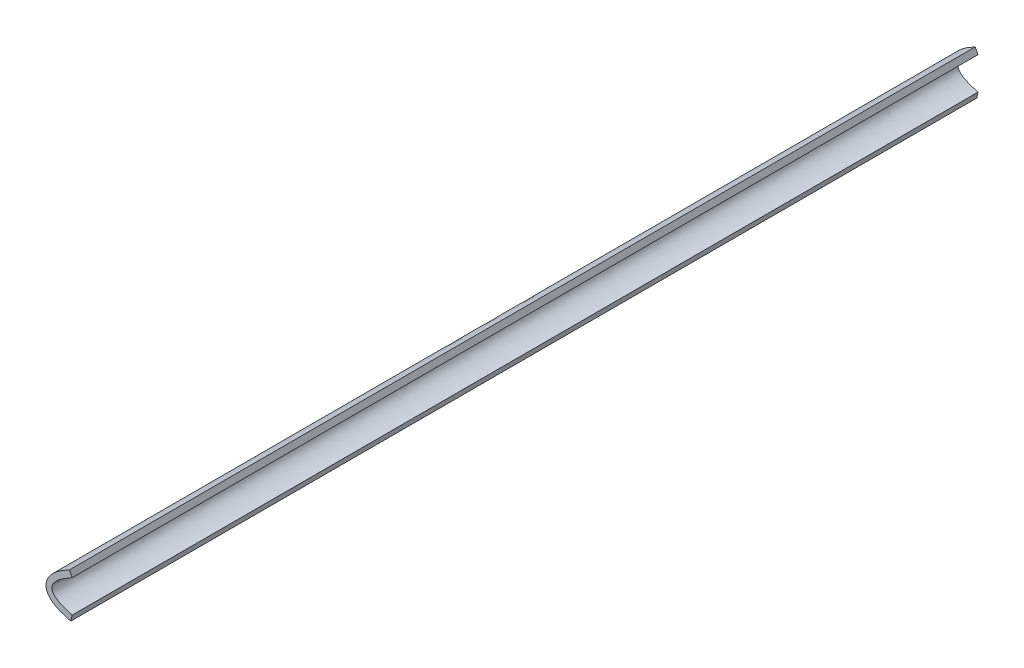
ISO-10303-21;
HEADER;
FILE_DESCRIPTION(('STEP AP214'),'2;1');
FILE_NAME('part.step','',(''),(''),'','','');
FILE_SCHEMA(('AUTOMOTIVE_DESIGN { 1 0 10303 214 1 1 1 1 }'));
ENDSEC;
DATA;
#1=APPLICATION_CONTEXT('core data for automotive mechanical design processes');
#2=APPLICATION_PROTOCOL_DEFINITION('international standard','automotive_design',2000,#1);
#3=PRODUCT_CONTEXT('',#1,'mechanical');
#4=PRODUCT('Part','Part','',(#3));
#5=PRODUCT_RELATED_PRODUCT_CATEGORY('part','',(#4));
#6=PRODUCT_DEFINITION_FORMATION('','',#4);
#7=PRODUCT_DEFINITION_CONTEXT('part definition',#1,'design');
#8=PRODUCT_DEFINITION('design','',#6,#7);
#9=PRODUCT_DEFINITION_SHAPE('','',#8);
#10=(LENGTH_UNIT() NAMED_UNIT(*) SI_UNIT(.MILLI.,.METRE.));
#11=(NAMED_UNIT(*) PLANE_ANGLE_UNIT() SI_UNIT($,.RADIAN.));
#12=(NAMED_UNIT(*) SI_UNIT($,.STERADIAN.) SOLID_ANGLE_UNIT());
#13=UNCERTAINTY_MEASURE_WITH_UNIT(LENGTH_MEASURE(1.E-05),#10,'distance_accuracy_value','');
#14=(GEOMETRIC_REPRESENTATION_CONTEXT(3) GLOBAL_UNCERTAINTY_ASSIGNED_CONTEXT((#13)) GLOBAL_UNIT_ASSIGNED_CONTEXT((#10,
#11,#12)) REPRESENTATION_CONTEXT('',''));
#15=CARTESIAN_POINT('',(0.,0.,0.));
#16=DIRECTION('',(0.,0.,1.));
#17=DIRECTION('',(1.,0.,0.));
#18=AXIS2_PLACEMENT_3D('',#15,#16,#17);
#19=CARTESIAN_POINT('',(21.4958554702346,18.1549970533936,750.));
#20=CARTESIAN_POINT('',(-12.0820568694319,0.0796441889705399,750.));
#21=CARTESIAN_POINT('',(21.4959399437409,-8.70720274628387,750.));
#22=B_SPLINE_CURVE_WITH_KNOTS('',2,(#19,#20,#21),.UNSPECIFIED.,.F.,.F.,(3,3),(0.,1.),.UNSPECIFIED.);
#23=DIRECTION('',(0.,0.,-1.));
#24=VECTOR('',#23,1.);
#25=SURFACE_OF_LINEAR_EXTRUSION('',#22,#24);
#26=CARTESIAN_POINT('',(21.4958554702346,18.1549970533936,0.));
#27=CARTESIAN_POINT('',(-12.0820568694319,0.0796441889705399,0.));
#28=CARTESIAN_POINT('',(21.4959399437409,-8.70720274628387,0.));
#29=B_SPLINE_CURVE_WITH_KNOTS('',2,(#26,#27,#28),.UNSPECIFIED.,.F.,.F.,(3,3),(0.,1.),.UNSPECIFIED.);
#30=CARTESIAN_POINT('',(21.4958554702346,18.1549970533936,0.));
#31=VERTEX_POINT('',#30);
#32=CARTESIAN_POINT('',(21.4959399437409,-8.70720274628387,0.));
#33=VERTEX_POINT('',#32);
#34=EDGE_CURVE('E141',#31,#33,#29,.T.);
#35=ORIENTED_EDGE('',*,*,#34,.F.);
#36=DIRECTION('',(0.,0.,-1.));
#37=VECTOR('',#36,1.);
#38=CARTESIAN_POINT('',(21.4958554702346,18.1549970533936,750.));
#39=LINE('',#38,#37);
#40=CARTESIAN_POINT('',(21.4958554702346,18.1549970533936,750.));
#41=VERTEX_POINT('',#40);
#42=EDGE_CURVE('E11',#41,#31,#39,.T.);
#43=ORIENTED_EDGE('',*,*,#42,.F.);
#44=CARTESIAN_POINT('',(21.4959399437409,-8.70720274628387,750.));
#45=VERTEX_POINT('',#44);
#46=EDGE_CURVE('E162',#41,#45,#22,.T.);
#47=ORIENTED_EDGE('',*,*,#46,.T.);
#48=DIRECTION('',(0.,0.,-1.));
#49=VECTOR('',#48,1.);
#50=CARTESIAN_POINT('',(21.4959399437409,-8.70720274628387,750.));
#51=LINE('',#50,#49);
#52=EDGE_CURVE('E58',#45,#33,#51,.T.);
#53=ORIENTED_EDGE('',*,*,#52,.T.);
#54=EDGE_LOOP('',(#35,#43,#47,#53));
#55=FACE_BOUND('',#54,.T.);
#56=ADVANCED_FACE('F41',(#55),#25,.T.);
#57=CARTESIAN_POINT('',(24.398905648412,12.4789294185756,750.));
#58=DIRECTION('',(0.890310765963519,0.455353423188464,0.));
#59=DIRECTION('',(-0.455353423188464,0.890310765963519,0.));
#60=AXIS2_PLACEMENT_3D('',#57,#58,#59);
#61=PLANE('',#60);
#62=DIRECTION('',(0.455353423188464,-0.890310765963519,0.));
#63=VECTOR('',#62,1.);
#64=CARTESIAN_POINT('',(24.398905648412,12.4789294185756,0.));
#65=LINE('',#64,#63);
#66=CARTESIAN_POINT('',(19.2190883542923,22.6065508832112,0.));
#67=VERTEX_POINT('',#66);
#68=EDGE_CURVE('E139',#67,#31,#65,.T.);
#69=ORIENTED_EDGE('',*,*,#68,.F.);
#70=DIRECTION('',(0.,0.,-1.));
#71=VECTOR('',#70,1.);
#72=CARTESIAN_POINT('',(19.2190883542923,22.6065508832112,750.));
#73=LINE('',#72,#71);
#74=CARTESIAN_POINT('',(19.2190883542923,22.6065508832112,750.));
#75=VERTEX_POINT('',#74);
#76=EDGE_CURVE('E50',#75,#67,#73,.T.);
#77=ORIENTED_EDGE('',*,*,#76,.F.);
#78=DIRECTION('',(0.455353423188464,-0.890310765963519,0.));
#79=VECTOR('',#78,1.);
#80=CARTESIAN_POINT('',(24.398905648412,12.4789294185756,750.));
#81=LINE('',#80,#79);
#82=EDGE_CURVE('E98',#75,#41,#81,.T.);
#83=ORIENTED_EDGE('',*,*,#82,.T.);
#84=ORIENTED_EDGE('',*,*,#42,.T.);
#85=EDGE_LOOP('',(#69,#77,#83,#84));
#86=FACE_BOUND('',#85,.T.);
#87=ADVANCED_FACE('F131',(#86),#61,.T.);
#88=CARTESIAN_POINT('',(300.070000000009,0.559999999999606,750.));
#89=CARTESIAN_POINT('',(300.046727210838,0.57014946527181,750.));
#90=CARTESIAN_POINT('',(299.951918410927,0.611496405472444,750.));
#91=CARTESIAN_POINT('',(299.731451090185,0.687910176410011,750.));
#92=CARTESIAN_POINT('',(299.360701306177,0.802077760347153,750.));
#93=CARTESIAN_POINT('',(298.851143071171,0.990049760142529,750.));
#94=CARTESIAN_POINT('',(298.192762058047,1.21498955742899,750.));
#95=CARTESIAN_POINT('',(297.39058131591,1.49834771116358,750.));
#96=CARTESIAN_POINT('',(296.440162643631,1.82713144456083,750.));
#97=CARTESIAN_POINT('',(295.347552696138,2.20591589840112,750.));
#98=CARTESIAN_POINT('',(294.109915847856,2.62641666355169,750.));
#99=CARTESIAN_POINT('',(292.734867314937,3.09787554254288,750.));
#100=CARTESIAN_POINT('',(291.212205013657,3.60330160879851,750.));
#101=CARTESIAN_POINT('',(289.556778296054,4.17036010371409,750.));
#102=CARTESIAN_POINT('',(287.754541523661,4.75022942363347,750.));
#103=CARTESIAN_POINT('',(285.826587722534,5.39992229408479,750.));
#104=CARTESIAN_POINT('',(283.756363975349,6.06242105527255,750.));
#105=CARTESIAN_POINT('',(281.558560220993,6.77588707650856,750.));
#106=CARTESIAN_POINT('',(279.225625429957,7.5173074076064,750.));
#107=CARTESIAN_POINT('',(276.759052145959,8.2802981760638,750.));
#108=CARTESIAN_POINT('',(274.172767845115,9.09557710973343,750.));
#109=CARTESIAN_POINT('',(271.45955356681,9.92624020632865,750.));
#110=CARTESIAN_POINT('',(268.620233524828,10.7707661803998,750.));
#111=CARTESIAN_POINT('',(265.66703106841,11.6559297276713,750.));
#112=CARTESIAN_POINT('',(262.589976023508,12.5399347522996,750.));
#113=CARTESIAN_POINT('',(259.406507792868,13.4644296130216,750.));
#114=CARTESIAN_POINT('',(256.106091200659,14.3932678621578,750.));
#115=CARTESIAN_POINT('',(252.694259978673,15.3300326956432,750.));
#116=CARTESIAN_POINT('',(249.183398903871,16.2926089703338,750.));
#117=CARTESIAN_POINT('',(245.565461502502,17.2514346555858,750.));
#118=CARTESIAN_POINT('',(241.852861879338,18.2210826299672,750.));
#119=CARTESIAN_POINT('',(238.042855475645,19.1913810301566,750.));
#120=CARTESIAN_POINT('',(234.140998951705,20.157357319934,750.));
#121=CARTESIAN_POINT('',(230.154027102527,21.1433044568455,750.));
#122=CARTESIAN_POINT('',(226.07941307726,22.108408476858,750.));
#123=CARTESIAN_POINT('',(221.926457871224,23.0703556384359,750.));
#124=CARTESIAN_POINT('',(217.6962775731,24.0199849043638,750.));
#125=CARTESIAN_POINT('',(213.392335784255,24.9575190841546,750.));
#126=CARTESIAN_POINT('',(209.022179153199,25.8870238282288,750.));
#127=CARTESIAN_POINT('',(204.590060503874,26.8099246596024,750.));
#128=CARTESIAN_POINT('',(200.100470304697,27.7094915488814,750.));
#129=CARTESIAN_POINT('',(195.551555783891,28.5748749529662,750.));
#130=CARTESIAN_POINT('',(190.95710115256,29.4405805115664,750.));
#131=CARTESIAN_POINT('',(186.312819207174,30.2661537119284,750.));
#132=CARTESIAN_POINT('',(181.629850434367,31.0690924620077,750.));
#133=CARTESIAN_POINT('',(176.9116334721,31.8335044141093,750.));
#134=CARTESIAN_POINT('',(172.163553807855,32.5897563409087,750.));
#135=CARTESIAN_POINT('',(167.38637831359,33.2979132291314,750.));
#136=CARTESIAN_POINT('',(162.585397476233,33.965141895421,750.));
#137=CARTESIAN_POINT('',(157.772606772563,34.6069052400814,750.));
#138=CARTESIAN_POINT('',(152.945783838143,35.2070309507983,750.));
#139=CARTESIAN_POINT('',(148.116103717064,35.7683712182421,750.));
#140=CARTESIAN_POINT('',(143.281947921397,36.2759641136444,750.));
#141=CARTESIAN_POINT('',(138.451826021007,36.7461668630659,750.));
#142=CARTESIAN_POINT('',(133.632024585046,37.1774202436999,750.));
#143=CARTESIAN_POINT('',(128.825099135922,37.5570095720901,750.));
#144=CARTESIAN_POINT('',(124.0352682766,37.8909649193306,750.));
#145=CARTESIAN_POINT('',(119.227934324095,38.1580563961838,750.));
#146=CARTESIAN_POINT('',(114.414879536341,38.3839309655849,750.));
#147=CARTESIAN_POINT('',(109.600810746422,38.5231711888418,750.));
#148=CARTESIAN_POINT('',(104.830170116063,38.5812091028124,750.));
#149=CARTESIAN_POINT('',(100.103024464491,38.5711871037619,750.));
#150=CARTESIAN_POINT('',(95.4289177756723,38.4952426315103,750.));
#151=CARTESIAN_POINT('',(90.8118079707387,38.3323263522947,750.));
#152=CARTESIAN_POINT('',(86.2578215279774,38.1037402151062,750.));
#153=CARTESIAN_POINT('',(81.7706420322065,37.8028926780969,750.));
#154=CARTESIAN_POINT('',(77.3556639029616,37.4394017022477,750.));
#155=CARTESIAN_POINT('',(73.0231073717325,36.9817558492871,750.));
#156=CARTESIAN_POINT('',(68.7745873700511,36.4785227821482,750.));
#157=CARTESIAN_POINT('',(64.6181040246302,35.8952175381654,750.));
#158=CARTESIAN_POINT('',(60.552867782823,35.2591686102274,750.));
#159=CARTESIAN_POINT('',(56.5894272314716,34.548268384025,750.));
#160=CARTESIAN_POINT('',(52.728147609376,33.7805282280188,750.));
#161=CARTESIAN_POINT('',(48.9784809853801,32.9486222007632,750.));
#162=CARTESIAN_POINT('',(45.3406482062456,32.0705009481565,750.));
#163=CARTESIAN_POINT('',(41.8175978305396,31.1446852043062,750.));
#164=CARTESIAN_POINT('',(38.4225138687805,30.1522778689638,750.));
#165=CARTESIAN_POINT('',(35.1484262755672,29.1221398243421,750.));
#166=CARTESIAN_POINT('',(32.0024888843364,28.0567605707498,750.));
#167=CARTESIAN_POINT('',(28.9910532160996,26.947357350049,750.));
#168=CARTESIAN_POINT('',(26.1161432589965,25.7977619494281,750.));
#169=CARTESIAN_POINT('',(23.3820300010664,24.605992476619,750.));
#170=CARTESIAN_POINT('',(20.7789312399974,23.403436919697,750.));
#171=CARTESIAN_POINT('',(18.3282822679355,22.1583471316499,750.));
#172=CARTESIAN_POINT('',(16.0188302677939,20.9064502673966,750.));
#173=CARTESIAN_POINT('',(13.8628973732302,19.6215652077166,750.));
#174=CARTESIAN_POINT('',(11.8547380257014,18.3242676681531,750.));
#175=CARTESIAN_POINT('',(9.99188655882919,17.0192098294199,750.));
#176=CARTESIAN_POINT('',(8.29105075030026,15.6956485942382,750.));
#177=CARTESIAN_POINT('',(6.73373760295228,14.3771786431372,750.));
#178=CARTESIAN_POINT('',(5.33311142752208,13.0499076520752,750.));
#179=CARTESIAN_POINT('',(4.08838789599282,11.7194177408118,750.));
#180=CARTESIAN_POINT('',(3.00075757832663,10.3893770732718,750.));
#181=CARTESIAN_POINT('',(2.0837737167411,9.05642543101119,750.));
#182=CARTESIAN_POINT('',(1.29666389493232,7.74190201537552,750.));
#183=CARTESIAN_POINT('',(0.688475961139798,6.42274039721468,750.));
#184=CARTESIAN_POINT('',(0.232629270456275,5.11301943414384,750.));
#185=CARTESIAN_POINT('',(-0.0741168979006899,3.81676478454145,750.));
#186=CARTESIAN_POINT('',(-0.216963808852273,2.52703073355145,750.));
#187=CARTESIAN_POINT('',(-0.194835648763117,1.25098158157196,750.));
#188=CARTESIAN_POINT('',(-0.0816996889988518,0.412720493044762,750.));
#189=CARTESIAN_POINT('',(6.86038103125013E-10,-3.46758561693545E-09,750.));
#190=B_SPLINE_CURVE_WITH_KNOTS('',3,(#88,#89,#90,#91,#92,#93,#94,#95,#96,#97,#98,#99,#100,#101,
#102,#103,#104,#105,#106,#107,#108,#109,#110,#111,#112,#113,#114,#115,#116,#117,#118,#119,#120,
#121,#122,#123,#124,#125,#126,#127,#128,#129,#130,#131,#132,#133,#134,#135,#136,#137,#138,#139,
#140,#141,#142,#143,#144,#145,#146,#147,#148,#149,#150,#151,#152,#153,#154,#155,#156,#157,#158,
#159,#160,#161,#162,#163,#164,#165,#166,#167,#168,#169,#170,#171,#172,#173,#174,#175,#176,#177,
#178,#179,#180,#181,#182,#183,#184,#185,#186,#187,#188,#189),.UNSPECIFIED.,.F.,.F.,(4,1,1,1,1,1,
1,1,1,1,1,1,1,1,1,1,1,1,1,1,1,1,1,1,1,1,1,1,1,1,1,1,1,1,1,1,1,1,1,1,1,1,1,1,1,1,1,1,1,1,1,1,1,1,
1,1,1,1,1,1,1,1,1,1,1,1,1,1,1,1,1,1,1,1,1,1,1,1,1,1,1,1,1,1,1,1,1,1,1,1,1,1,1,1,1,1,1,1,1,4),
(0.,0.000121802045916605,0.000496197757592308,0.00111829754146197,0.00198327247421803,
0.00310109503456608,0.00445667065088207,0.00606510026662876,0.00792639033067934,
0.0100051006761166,0.0123366827495954,0.0149008679576207,0.0177027715059171,0.0207322847510818,
0.0239842963399837,0.027464026273719,0.031161268245018,0.0350711538259491,0.0392090248767433,
0.0435491612294342,0.0480820960038832,0.0528232938835928,0.0577621196773443,0.0628742543135626,
0.0681840845984971,0.0736674862169605,0.0793246499392333,0.0851599372063481,0.0911342131365787,
0.0972826896563106,0.103570554381949,0.10999800798771,0.116569034804591,0.123276218058606,
0.13008874608338,0.137022467248384,0.144077656318622,0.151223284866333,0.158459530455229,
0.165799086141327,0.173192203581115,0.180676632663918,0.188231102607015,0.195824579266017,
0.203473250814262,0.211164226832504,0.218892941548552,0.22664419478934,0.234420668227768,
0.242188980013251,0.249981422868409,0.257749174871681,0.265510469999164,0.273265830607315,
0.280966677998178,0.288645671703493,0.296302699243563,0.304067470550499,0.31176355002067,
0.319408993713125,0.326957891756819,0.334443892775123,0.341837269696896,0.349123554457684,
0.356320598702043,0.363414402847302,0.370376839159325,0.377222795683193,0.383940401176468,
0.390513899376016,0.396964016788803,0.403259098024054,0.40940176833071,0.415391074824066,
0.421213921667111,0.426877502278438,0.432360647328028,0.437681281381694,0.442812194902764,
0.447757076574934,0.452534712671014,0.457121248364812,0.461512912707052,0.465721241925177,
0.469723075006934,0.473551513613339,0.477190036693361,0.48063229623885,0.483888395344838,
0.486976776934193,0.489884980817169,0.492625083473646,0.495211517132313,0.497641776091882,
0.499967426494959,0.502167608105882,0.504285811993246,0.506345174727357,0.508376587381055,
0.510394165054345),.UNSPECIFIED.);
#191=DIRECTION('',(0.,0.,-1.));
#192=VECTOR('',#191,1.);
#193=SURFACE_OF_LINEAR_EXTRUSION('',#190,#192);
#194=CARTESIAN_POINT('',(300.070000000009,0.559999999999606,0.));
#195=CARTESIAN_POINT('',(300.046727210838,0.57014946527181,0.));
#196=CARTESIAN_POINT('',(299.951918410927,0.611496405472444,0.));
#197=CARTESIAN_POINT('',(299.731451090185,0.687910176410011,0.));
#198=CARTESIAN_POINT('',(299.360701306177,0.802077760347153,0.));
#199=CARTESIAN_POINT('',(298.851143071171,0.990049760142529,0.));
#200=CARTESIAN_POINT('',(298.192762058047,1.21498955742899,0.));
#201=CARTESIAN_POINT('',(297.39058131591,1.49834771116358,0.));
#202=CARTESIAN_POINT('',(296.440162643631,1.82713144456083,0.));
#203=CARTESIAN_POINT('',(295.347552696138,2.20591589840112,0.));
#204=CARTESIAN_POINT('',(294.109915847856,2.62641666355169,0.));
#205=CARTESIAN_POINT('',(292.734867314937,3.09787554254288,0.));
#206=CARTESIAN_POINT('',(291.212205013657,3.60330160879851,0.));
#207=CARTESIAN_POINT('',(289.556778296054,4.17036010371409,0.));
#208=CARTESIAN_POINT('',(287.754541523661,4.75022942363347,0.));
#209=CARTESIAN_POINT('',(285.826587722534,5.39992229408479,0.));
#210=CARTESIAN_POINT('',(283.756363975349,6.06242105527255,0.));
#211=CARTESIAN_POINT('',(281.558560220993,6.77588707650856,0.));
#212=CARTESIAN_POINT('',(279.225625429957,7.5173074076064,0.));
#213=CARTESIAN_POINT('',(276.759052145959,8.2802981760638,0.));
#214=CARTESIAN_POINT('',(274.172767845115,9.09557710973343,0.));
#215=CARTESIAN_POINT('',(271.45955356681,9.92624020632865,0.));
#216=CARTESIAN_POINT('',(268.620233524828,10.7707661803998,0.));
#217=CARTESIAN_POINT('',(265.66703106841,11.6559297276713,0.));
#218=CARTESIAN_POINT('',(262.589976023508,12.5399347522996,0.));
#219=CARTESIAN_POINT('',(259.406507792868,13.4644296130216,0.));
#220=CARTESIAN_POINT('',(256.106091200659,14.3932678621578,0.));
#221=CARTESIAN_POINT('',(252.694259978673,15.3300326956432,0.));
#222=CARTESIAN_POINT('',(249.183398903871,16.2926089703338,0.));
#223=CARTESIAN_POINT('',(245.565461502502,17.2514346555858,0.));
#224=CARTESIAN_POINT('',(241.852861879338,18.2210826299672,0.));
#225=CARTESIAN_POINT('',(238.042855475645,19.1913810301566,0.));
#226=CARTESIAN_POINT('',(234.140998951705,20.157357319934,0.));
#227=CARTESIAN_POINT('',(230.154027102527,21.1433044568455,0.));
#228=CARTESIAN_POINT('',(226.07941307726,22.108408476858,0.));
#229=CARTESIAN_POINT('',(221.926457871224,23.0703556384359,0.));
#230=CARTESIAN_POINT('',(217.6962775731,24.0199849043638,0.));
#231=CARTESIAN_POINT('',(213.392335784255,24.9575190841546,0.));
#232=CARTESIAN_POINT('',(209.022179153199,25.8870238282288,0.));
#233=CARTESIAN_POINT('',(204.590060503874,26.8099246596024,0.));
#234=CARTESIAN_POINT('',(200.100470304697,27.7094915488814,0.));
#235=CARTESIAN_POINT('',(195.551555783891,28.5748749529662,0.));
#236=CARTESIAN_POINT('',(190.95710115256,29.4405805115664,0.));
#237=CARTESIAN_POINT('',(186.312819207174,30.2661537119284,0.));
#238=CARTESIAN_POINT('',(181.629850434367,31.0690924620077,0.));
#239=CARTESIAN_POINT('',(176.9116334721,31.8335044141093,0.));
#240=CARTESIAN_POINT('',(172.163553807855,32.5897563409087,0.));
#241=CARTESIAN_POINT('',(167.38637831359,33.2979132291314,0.));
#242=CARTESIAN_POINT('',(162.585397476233,33.965141895421,0.));
#243=CARTESIAN_POINT('',(157.772606772563,34.6069052400814,0.));
#244=CARTESIAN_POINT('',(152.945783838143,35.2070309507983,0.));
#245=CARTESIAN_POINT('',(148.116103717064,35.7683712182421,0.));
#246=CARTESIAN_POINT('',(143.281947921397,36.2759641136444,0.));
#247=CARTESIAN_POINT('',(138.451826021007,36.7461668630659,0.));
#248=CARTESIAN_POINT('',(133.632024585046,37.1774202436999,0.));
#249=CARTESIAN_POINT('',(128.825099135922,37.5570095720901,0.));
#250=CARTESIAN_POINT('',(124.0352682766,37.8909649193306,0.));
#251=CARTESIAN_POINT('',(119.227934324095,38.1580563961838,0.));
#252=CARTESIAN_POINT('',(114.414879536341,38.3839309655849,0.));
#253=CARTESIAN_POINT('',(109.600810746422,38.5231711888418,0.));
#254=CARTESIAN_POINT('',(104.830170116063,38.5812091028124,0.));
#255=CARTESIAN_POINT('',(100.103024464491,38.5711871037619,0.));
#256=CARTESIAN_POINT('',(95.4289177756723,38.4952426315103,0.));
#257=CARTESIAN_POINT('',(90.8118079707387,38.3323263522947,0.));
#258=CARTESIAN_POINT('',(86.2578215279774,38.1037402151062,0.));
#259=CARTESIAN_POINT('',(81.7706420322065,37.8028926780969,0.));
#260=CARTESIAN_POINT('',(77.3556639029616,37.4394017022477,0.));
#261=CARTESIAN_POINT('',(73.0231073717325,36.9817558492871,0.));
#262=CARTESIAN_POINT('',(68.7745873700511,36.4785227821482,0.));
#263=CARTESIAN_POINT('',(64.6181040246302,35.8952175381654,0.));
#264=CARTESIAN_POINT('',(60.552867782823,35.2591686102274,0.));
#265=CARTESIAN_POINT('',(56.5894272314716,34.548268384025,0.));
#266=CARTESIAN_POINT('',(52.728147609376,33.7805282280188,0.));
#267=CARTESIAN_POINT('',(48.9784809853801,32.9486222007632,0.));
#268=CARTESIAN_POINT('',(45.3406482062456,32.0705009481565,0.));
#269=CARTESIAN_POINT('',(41.8175978305396,31.1446852043062,0.));
#270=CARTESIAN_POINT('',(38.4225138687805,30.1522778689638,0.));
#271=CARTESIAN_POINT('',(35.1484262755672,29.1221398243421,0.));
#272=CARTESIAN_POINT('',(32.0024888843364,28.0567605707498,0.));
#273=CARTESIAN_POINT('',(28.9910532160996,26.947357350049,0.));
#274=CARTESIAN_POINT('',(26.1161432589965,25.7977619494281,0.));
#275=CARTESIAN_POINT('',(23.3820300010664,24.605992476619,0.));
#276=CARTESIAN_POINT('',(20.7789312399974,23.403436919697,0.));
#277=CARTESIAN_POINT('',(18.3282822679355,22.1583471316499,0.));
#278=CARTESIAN_POINT('',(16.0188302677939,20.9064502673966,0.));
#279=CARTESIAN_POINT('',(13.8628973732302,19.6215652077166,0.));
#280=CARTESIAN_POINT('',(11.8547380257014,18.3242676681531,0.));
#281=CARTESIAN_POINT('',(9.99188655882919,17.0192098294199,0.));
#282=CARTESIAN_POINT('',(8.29105075030026,15.6956485942382,0.));
#283=CARTESIAN_POINT('',(6.73373760295228,14.3771786431372,0.));
#284=CARTESIAN_POINT('',(5.33311142752208,13.0499076520752,0.));
#285=CARTESIAN_POINT('',(4.08838789599282,11.7194177408118,0.));
#286=CARTESIAN_POINT('',(3.00075757832663,10.3893770732718,0.));
#287=CARTESIAN_POINT('',(2.0837737167411,9.05642543101119,0.));
#288=CARTESIAN_POINT('',(1.29666389493232,7.74190201537552,0.));
#289=CARTESIAN_POINT('',(0.688475961139798,6.42274039721468,0.));
#290=CARTESIAN_POINT('',(0.232629270456275,5.11301943414384,0.));
#291=CARTESIAN_POINT('',(-0.0741168979006899,3.81676478454145,0.));
#292=CARTESIAN_POINT('',(-0.216963808852273,2.52703073355145,0.));
#293=CARTESIAN_POINT('',(-0.194835648763117,1.25098158157196,0.));
#294=CARTESIAN_POINT('',(-0.0816996889988518,0.412720493044762,0.));
#295=CARTESIAN_POINT('',(6.86038103125013E-10,-3.46758561693545E-09,0.));
#296=B_SPLINE_CURVE_WITH_KNOTS('',3,(#194,#195,#196,#197,#198,#199,#200,#201,#202,#203,#204,
#205,#206,#207,#208,#209,#210,#211,#212,#213,#214,#215,#216,#217,#218,#219,#220,#221,#222,#223,
#224,#225,#226,#227,#228,#229,#230,#231,#232,#233,#234,#235,#236,#237,#238,#239,#240,#241,#242,
#243,#244,#245,#246,#247,#248,#249,#250,#251,#252,#253,#254,#255,#256,#257,#258,#259,#260,#261,
#262,#263,#264,#265,#266,#267,#268,#269,#270,#271,#272,#273,#274,#275,#276,#277,#278,#279,#280,
#281,#282,#283,#284,#285,#286,#287,#288,#289,#290,#291,#292,#293,#294,#295),.UNSPECIFIED.,.F.,
.F.,(4,1,1,1,1,1,1,1,1,1,1,1,1,1,1,1,1,1,1,1,1,1,1,1,1,1,1,1,1,1,1,1,1,1,1,1,1,1,1,1,1,1,1,1,1,
1,1,1,1,1,1,1,1,1,1,1,1,1,1,1,1,1,1,1,1,1,1,1,1,1,1,1,1,1,1,1,1,1,1,1,1,1,1,1,1,1,1,1,1,1,1,1,1,
1,1,1,1,1,1,4),(0.,0.000121802045916605,0.000496197757592308,0.00111829754146197,
0.00198327247421803,0.00310109503456608,0.00445667065088207,0.00606510026662876,
0.00792639033067934,0.0100051006761166,0.0123366827495954,0.0149008679576207,0.0177027715059171,
0.0207322847510818,0.0239842963399837,0.027464026273719,0.031161268245018,0.0350711538259491,
0.0392090248767433,0.0435491612294342,0.0480820960038832,0.0528232938835928,0.0577621196773443,
0.0628742543135626,0.0681840845984971,0.0736674862169605,0.0793246499392333,0.0851599372063481,
0.0911342131365787,0.0972826896563106,0.103570554381949,0.10999800798771,0.116569034804591,
0.123276218058606,0.13008874608338,0.137022467248384,0.144077656318622,0.151223284866333,
0.158459530455229,0.165799086141327,0.173192203581115,0.180676632663918,0.188231102607015,
0.195824579266017,0.203473250814262,0.211164226832504,0.218892941548552,0.22664419478934,
0.234420668227768,0.242188980013251,0.249981422868409,0.257749174871681,0.265510469999164,
0.273265830607315,0.280966677998178,0.288645671703493,0.296302699243563,0.304067470550499,
0.31176355002067,0.319408993713125,0.326957891756819,0.334443892775123,0.341837269696896,
0.349123554457684,0.356320598702043,0.363414402847302,0.370376839159325,0.377222795683193,
0.383940401176468,0.390513899376016,0.396964016788803,0.403259098024054,0.40940176833071,
0.415391074824066,0.421213921667111,0.426877502278438,0.432360647328028,0.437681281381694,
0.442812194902764,0.447757076574934,0.452534712671014,0.457121248364812,0.461512912707052,
0.465721241925177,0.469723075006934,0.473551513613339,0.477190036693361,0.48063229623885,
0.483888395344838,0.486976776934193,0.489884980817169,0.492625083473646,0.495211517132313,
0.497641776091882,0.499967426494959,0.502167608105882,0.504285811993246,0.506345174727357,
0.508376587381055,0.510394165054345),.UNSPECIFIED.);
#297=CARTESIAN_POINT('',(6.86038103125013E-10,-3.46758561693545E-09,0.));
#298=VERTEX_POINT('',#297);
#299=EDGE_CURVE('E105',#67,#298,#296,.T.);
#300=ORIENTED_EDGE('',*,*,#299,.T.);
#301=DIRECTION('',(0.,0.,-1.));
#302=VECTOR('',#301,1.);
#303=CARTESIAN_POINT('',(6.86038103125013E-10,-3.46758561693545E-09,750.));
#304=LINE('',#303,#302);
#305=CARTESIAN_POINT('',(6.86038103125013E-10,-3.46758561693545E-09,750.));
#306=VERTEX_POINT('',#305);
#307=EDGE_CURVE('E102',#306,#298,#304,.T.);
#308=ORIENTED_EDGE('',*,*,#307,.F.);
#309=EDGE_CURVE('E91',#75,#306,#190,.T.);
#310=ORIENTED_EDGE('',*,*,#309,.F.);
#311=ORIENTED_EDGE('',*,*,#76,.T.);
#312=EDGE_LOOP('',(#300,#308,#310,#311));
#313=FACE_BOUND('',#312,.T.);
#314=ADVANCED_FACE('F103',(#313),#193,.F.);
#315=CARTESIAN_POINT('',(6.86010343152365E-10,-3.46758732944648E-09,750.));
#316=CARTESIAN_POINT('',(0.08168428698684,-0.412642687048914,750.));
#317=CARTESIAN_POINT('',(0.29643779221108,-1.23084882425444,750.));
#318=CARTESIAN_POINT('',(0.768361471156949,-2.41716894104676,750.));
#319=CARTESIAN_POINT('',(1.39503923147957,-3.55210015011684,750.));
#320=CARTESIAN_POINT('',(2.16439563511027,-4.63750206900586,750.));
#321=CARTESIAN_POINT('',(3.06393370947614,-5.68077839054713,750.));
#322=CARTESIAN_POINT('',(4.11804776311139,-6.66154416179366,750.));
#323=CARTESIAN_POINT('',(5.29953436327256,-7.60405965629537,750.));
#324=CARTESIAN_POINT('',(6.62863449802136,-8.49170476482325,750.));
#325=CARTESIAN_POINT('',(8.08798571884851,-9.34013183682808,750.));
#326=CARTESIAN_POINT('',(9.68204057253338,-10.139020115648,750.));
#327=CARTESIAN_POINT('',(11.4030680916886,-10.884858394614,750.));
#328=CARTESIAN_POINT('',(13.2505090341335,-11.589254086622,750.));
#329=CARTESIAN_POINT('',(15.2269841697117,-12.2280550439366,750.));
#330=CARTESIAN_POINT('',(17.3219522475322,-12.8451616004499,750.));
#331=CARTESIAN_POINT('',(19.5427708769133,-13.3974736552887,750.));
#332=CARTESIAN_POINT('',(21.8793057893119,-13.9187021646013,750.));
#333=CARTESIAN_POINT('',(24.3338022228834,-14.3886167059853,750.));
#334=CARTESIAN_POINT('',(26.9026774808353,-14.802759919061,750.));
#335=CARTESIAN_POINT('',(29.5790329825374,-15.1866441069216,750.));
#336=CARTESIAN_POINT('',(32.3647270664427,-15.5073171420312,750.));
#337=CARTESIAN_POINT('',(35.2497968202069,-15.8183955505852,750.));
#338=CARTESIAN_POINT('',(38.2422431604414,-16.0454461885373,750.));
#339=CARTESIAN_POINT('',(41.3318285242188,-16.2609817770736,750.));
#340=CARTESIAN_POINT('',(44.5190158754654,-16.4283061200292,750.));
#341=CARTESIAN_POINT('',(47.799283262828,-16.5581196969077,750.));
#342=CARTESIAN_POINT('',(51.1662389701078,-16.6479328939463,750.));
#343=CARTESIAN_POINT('',(54.6198609300622,-16.695073810502,750.));
#344=CARTESIAN_POINT('',(58.1599653505791,-16.7142959907614,750.));
#345=CARTESIAN_POINT('',(61.7835188431424,-16.7082647171375,750.));
#346=CARTESIAN_POINT('',(65.4834633590841,-16.6508259867193,750.));
#347=CARTESIAN_POINT('',(69.2569856491823,-16.5848920488685,750.));
#348=CARTESIAN_POINT('',(73.1037745798507,-16.4844848850199,750.));
#349=CARTESIAN_POINT('',(77.0202592722721,-16.3508026196804,750.));
#350=CARTESIAN_POINT('',(81.0039794969251,-16.2056434379451,750.));
#351=CARTESIAN_POINT('',(85.0500683642102,-16.0180896331925,750.));
#352=CARTESIAN_POINT('',(89.1571653787501,-15.8337159379273,750.));
#353=CARTESIAN_POINT('',(93.3201451343298,-15.6193919065088,750.));
#354=CARTESIAN_POINT('',(97.5368210232667,-15.3996749242203,750.));
#355=CARTESIAN_POINT('',(101.80725321727,-15.1737887607578,750.));
#356=CARTESIAN_POINT('',(106.123150677686,-14.9168069756067,750.));
#357=CARTESIAN_POINT('',(110.483633276907,-14.6718318403938,750.));
#358=CARTESIAN_POINT('',(114.883266317732,-14.4088537299499,750.));
#359=CARTESIAN_POINT('',(119.352975093204,-14.1438502002129,750.));
#360=CARTESIAN_POINT('',(123.894349232029,-13.8970193049098,750.));
#361=CARTESIAN_POINT('',(128.496857286776,-13.5995010083276,750.));
#362=CARTESIAN_POINT('',(133.130234778128,-13.3003240217907,750.));
#363=CARTESIAN_POINT('',(137.784055517228,-12.993867356776,750.));
#364=CARTESIAN_POINT('',(142.453682427155,-12.6614740565246,750.));
#365=CARTESIAN_POINT('',(147.129863452571,-12.318169380912,750.));
#366=CARTESIAN_POINT('',(151.814228379386,-11.9853167344393,750.));
#367=CARTESIAN_POINT('',(156.499893797324,-11.6185724445053,750.));
#368=CARTESIAN_POINT('',(161.183377828108,-11.2606019236378,750.));
#369=CARTESIAN_POINT('',(165.860460189637,-10.9025488597506,750.));
#370=CARTESIAN_POINT('',(170.523341725827,-10.5300973915269,750.));
#371=CARTESIAN_POINT('',(175.170121140126,-10.1615202930905,750.));
#372=CARTESIAN_POINT('',(179.793367843169,-9.79042877802554,750.));
#373=CARTESIAN_POINT('',(184.390167200322,-9.42207701846059,750.));
#374=CARTESIAN_POINT('',(188.959593481163,-9.04825961775901,750.));
#375=CARTESIAN_POINT('',(193.496862610415,-8.69245709593373,750.));
#376=CARTESIAN_POINT('',(197.993446271768,-8.33140201520253,750.));
#377=CARTESIAN_POINT('',(202.443627904182,-7.97364305459564,750.));
#378=CARTESIAN_POINT('',(206.842502753098,-7.60628208488407,750.));
#379=CARTESIAN_POINT('',(211.190292550163,-7.27370176009231,750.));
#380=CARTESIAN_POINT('',(215.480211958673,-6.93265212483035,750.));
#381=CARTESIAN_POINT('',(219.709739235407,-6.59006458587067,750.));
#382=CARTESIAN_POINT('',(223.873233644342,-6.26206836723984,750.));
#383=CARTESIAN_POINT('',(227.966396089271,-5.9398476619633,750.));
#384=CARTESIAN_POINT('',(231.983748001244,-5.63533938180436,750.));
#385=CARTESIAN_POINT('',(235.919297627122,-5.31754575452866,750.));
#386=CARTESIAN_POINT('',(239.77370870658,-5.03491559697022,750.));
#387=CARTESIAN_POINT('',(243.536538120906,-4.74165773777177,750.));
#388=CARTESIAN_POINT('',(247.209812190136,-4.46085993007788,750.));
#389=CARTESIAN_POINT('',(250.787106764707,-4.19576061649392,750.));
#390=CARTESIAN_POINT('',(254.266072169246,-3.91883561359546,750.));
#391=CARTESIAN_POINT('',(257.643250160136,-3.6721839334308,750.));
#392=CARTESIAN_POINT('',(260.913793207287,-3.4361759851998,750.));
#393=CARTESIAN_POINT('',(264.072684975458,-3.18790963619195,750.));
#394=CARTESIAN_POINT('',(267.117194027154,-2.9771463747341,750.));
#395=CARTESIAN_POINT('',(270.043161250345,-2.75101341585552,750.));
#396=CARTESIAN_POINT('',(272.846765873569,-2.54470011257798,750.));
#397=CARTESIAN_POINT('',(275.52942919854,-2.33878815971674,750.));
#398=CARTESIAN_POINT('',(278.087148077472,-2.16666667438527,750.));
#399=CARTESIAN_POINT('',(280.513268395164,-1.98242531383613,750.));
#400=CARTESIAN_POINT('',(282.806745265545,-1.81443576932335,750.));
#401=CARTESIAN_POINT('',(284.962823137036,-1.64955214309113,750.));
#402=CARTESIAN_POINT('',(286.983837233579,-1.51701069421092,750.));
#403=CARTESIAN_POINT('',(288.86325736509,-1.37227380954508,750.));
#404=CARTESIAN_POINT('',(290.600165155571,-1.24558756488331,750.));
#405=CARTESIAN_POINT('',(292.192790163112,-1.11915950224588,750.));
#406=CARTESIAN_POINT('',(293.640594785675,-1.02816418679108,750.));
#407=CARTESIAN_POINT('',(294.939565332546,-0.92070431694592,750.));
#408=CARTESIAN_POINT('',(296.089960300949,-0.842870725052759,750.));
#409=CARTESIAN_POINT('',(297.090587220823,-0.777681987494267,750.));
#410=CARTESIAN_POINT('',(297.939585238316,-0.70130185738506,750.));
#411=CARTESIAN_POINT('',(298.636651950482,-0.653077401387046,750.));
#412=CARTESIAN_POINT('',(299.177018781558,-0.618208826708505,750.));
#413=CARTESIAN_POINT('',(299.562595701666,-0.575799674164568,750.));
#414=CARTESIAN_POINT('',(299.79734919339,-0.578243239164238,750.));
#415=CARTESIAN_POINT('',(299.90336017084,-0.563663730262078,750.));
#416=CARTESIAN_POINT('',(299.929999999991,-0.559999999999512,750.));
#417=B_SPLINE_CURVE_WITH_KNOTS('',3,(#315,#316,#317,#318,#319,#320,#321,#322,#323,#324,#325,
#326,#327,#328,#329,#330,#331,#332,#333,#334,#335,#336,#337,#338,#339,#340,#341,#342,#343,#344,
#345,#346,#347,#348,#349,#350,#351,#352,#353,#354,#355,#356,#357,#358,#359,#360,#361,#362,#363,
#364,#365,#366,#367,#368,#369,#370,#371,#372,#373,#374,#375,#376,#377,#378,#379,#380,#381,#382,
#383,#384,#385,#386,#387,#388,#389,#390,#391,#392,#393,#394,#395,#396,#397,#398,#399,#400,#401,
#402,#403,#404,#405,#406,#407,#408,#409,#410,#411,#412,#413,#414,#415,#416),.UNSPECIFIED.,.F.,
.F.,(4,1,1,1,1,1,1,1,1,1,1,1,1,1,1,1,1,1,1,1,1,1,1,1,1,1,1,1,1,1,1,1,1,1,1,1,1,1,1,1,1,1,1,1,1,
1,1,1,1,1,1,1,1,1,1,1,1,1,1,1,1,1,1,1,1,1,1,1,1,1,1,1,1,1,1,1,1,1,1,1,1,1,1,1,1,1,1,1,1,1,1,1,1,
1,1,1,1,1,1,4),(0.510394165054345,0.512411362351637,0.514442775005336,0.516504186146814,
0.518616282986581,0.520815941374538,0.52310137417107,0.52551420412258,0.528060370238057,
0.530762306993531,0.533608996019813,0.536610005944519,0.539758552070476,0.543091515136878,
0.546573596537661,0.550235349948387,0.554069096490516,0.558058926974622,0.562223754924467,
0.566552856289207,0.571030234918836,0.575677161731586,0.580474566261676,0.585427924053139,
0.590537055672864,0.595787006934838,0.601178701806172,0.606697001543169,0.612358752726766,
0.618164376111839,0.624082471505276,0.630113019620036,0.636272552317013,0.64254540865324,
0.648915297875715,0.655399015903059,0.661979320195946,0.668641043209263,0.675399420045521,
0.682238498238121,0.689159203277062,0.696143776007776,0.703193143687113,0.710306374538354,
0.717627174011905,0.725014701728468,0.732435170353137,0.739904563937781,0.747392102399747,
0.754896736460748,0.762401370521748,0.769924336473027,0.777447302424306,0.784938375809219,
0.792430695411681,0.799891128581962,0.807303733725319,0.814684454614634,0.822017350797373,
0.829301142641949,0.836521162869281,0.843661473655919,0.850722080825709,0.857700425049739,
0.864583104763581,0.87137012832007,0.87806022371642,0.884621511633568,0.891069943428069,
0.897390814479484,0.903565713862671,0.909613035181241,0.915499668178881,0.921241563258684,
0.926823990297297,0.932244523470366,0.93748842971305,0.942556896933455,0.947447554919404,
0.952130861472029,0.956637537170943,0.960935685066861,0.965040101801286,0.968937143772775,
0.972609708612879,0.97607374592087,0.979312161013132,0.982327244194811,0.985117850528837,
0.987668031890042,0.989992582174607,0.992077865387908,0.993921550450856,0.995524803260075,
0.996888843664504,0.998011233445347,0.998877242772344,0.999486882686978,0.999871057150102,1.),.UNSPECIFIED.);
#418=DIRECTION('',(0.,0.,-1.));
#419=VECTOR('',#418,1.);
#420=SURFACE_OF_LINEAR_EXTRUSION('',#417,#419);
#421=CARTESIAN_POINT('',(6.86010343152365E-10,-3.46758732944648E-09,0.));
#422=CARTESIAN_POINT('',(0.08168428698684,-0.412642687048914,0.));
#423=CARTESIAN_POINT('',(0.29643779221108,-1.23084882425444,0.));
#424=CARTESIAN_POINT('',(0.768361471156949,-2.41716894104676,0.));
#425=CARTESIAN_POINT('',(1.39503923147957,-3.55210015011684,0.));
#426=CARTESIAN_POINT('',(2.16439563511027,-4.63750206900586,0.));
#427=CARTESIAN_POINT('',(3.06393370947614,-5.68077839054713,0.));
#428=CARTESIAN_POINT('',(4.11804776311139,-6.66154416179366,0.));
#429=CARTESIAN_POINT('',(5.29953436327256,-7.60405965629537,0.));
#430=CARTESIAN_POINT('',(6.62863449802136,-8.49170476482325,0.));
#431=CARTESIAN_POINT('',(8.08798571884851,-9.34013183682808,0.));
#432=CARTESIAN_POINT('',(9.68204057253338,-10.139020115648,0.));
#433=CARTESIAN_POINT('',(11.4030680916886,-10.884858394614,0.));
#434=CARTESIAN_POINT('',(13.2505090341335,-11.589254086622,0.));
#435=CARTESIAN_POINT('',(15.2269841697117,-12.2280550439366,0.));
#436=CARTESIAN_POINT('',(17.3219522475322,-12.8451616004499,0.));
#437=CARTESIAN_POINT('',(19.5427708769133,-13.3974736552887,0.));
#438=CARTESIAN_POINT('',(21.8793057893119,-13.9187021646013,0.));
#439=CARTESIAN_POINT('',(24.3338022228834,-14.3886167059853,0.));
#440=CARTESIAN_POINT('',(26.9026774808353,-14.802759919061,0.));
#441=CARTESIAN_POINT('',(29.5790329825374,-15.1866441069216,0.));
#442=CARTESIAN_POINT('',(32.3647270664427,-15.5073171420312,0.));
#443=CARTESIAN_POINT('',(35.2497968202069,-15.8183955505852,0.));
#444=CARTESIAN_POINT('',(38.2422431604414,-16.0454461885373,0.));
#445=CARTESIAN_POINT('',(41.3318285242188,-16.2609817770736,0.));
#446=CARTESIAN_POINT('',(44.5190158754654,-16.4283061200292,0.));
#447=CARTESIAN_POINT('',(47.799283262828,-16.5581196969077,0.));
#448=CARTESIAN_POINT('',(51.1662389701078,-16.6479328939463,0.));
#449=CARTESIAN_POINT('',(54.6198609300622,-16.695073810502,0.));
#450=CARTESIAN_POINT('',(58.1599653505791,-16.7142959907614,0.));
#451=CARTESIAN_POINT('',(61.7835188431424,-16.7082647171375,0.));
#452=CARTESIAN_POINT('',(65.4834633590841,-16.6508259867193,0.));
#453=CARTESIAN_POINT('',(69.2569856491823,-16.5848920488685,0.));
#454=CARTESIAN_POINT('',(73.1037745798507,-16.4844848850199,0.));
#455=CARTESIAN_POINT('',(77.0202592722721,-16.3508026196804,0.));
#456=CARTESIAN_POINT('',(81.0039794969251,-16.2056434379451,0.));
#457=CARTESIAN_POINT('',(85.0500683642102,-16.0180896331925,0.));
#458=CARTESIAN_POINT('',(89.1571653787501,-15.8337159379273,0.));
#459=CARTESIAN_POINT('',(93.3201451343298,-15.6193919065088,0.));
#460=CARTESIAN_POINT('',(97.5368210232667,-15.3996749242203,0.));
#461=CARTESIAN_POINT('',(101.80725321727,-15.1737887607578,0.));
#462=CARTESIAN_POINT('',(106.123150677686,-14.9168069756067,0.));
#463=CARTESIAN_POINT('',(110.483633276907,-14.6718318403938,0.));
#464=CARTESIAN_POINT('',(114.883266317732,-14.4088537299499,0.));
#465=CARTESIAN_POINT('',(119.352975093204,-14.1438502002129,0.));
#466=CARTESIAN_POINT('',(123.894349232029,-13.8970193049098,0.));
#467=CARTESIAN_POINT('',(128.496857286776,-13.5995010083276,0.));
#468=CARTESIAN_POINT('',(133.130234778128,-13.3003240217907,0.));
#469=CARTESIAN_POINT('',(137.784055517228,-12.993867356776,0.));
#470=CARTESIAN_POINT('',(142.453682427155,-12.6614740565246,0.));
#471=CARTESIAN_POINT('',(147.129863452571,-12.318169380912,0.));
#472=CARTESIAN_POINT('',(151.814228379386,-11.9853167344393,0.));
#473=CARTESIAN_POINT('',(156.499893797324,-11.6185724445053,0.));
#474=CARTESIAN_POINT('',(161.183377828108,-11.2606019236378,0.));
#475=CARTESIAN_POINT('',(165.860460189637,-10.9025488597506,0.));
#476=CARTESIAN_POINT('',(170.523341725827,-10.5300973915269,0.));
#477=CARTESIAN_POINT('',(175.170121140126,-10.1615202930905,0.));
#478=CARTESIAN_POINT('',(179.793367843169,-9.79042877802554,0.));
#479=CARTESIAN_POINT('',(184.390167200322,-9.42207701846059,0.));
#480=CARTESIAN_POINT('',(188.959593481163,-9.04825961775901,0.));
#481=CARTESIAN_POINT('',(193.496862610415,-8.69245709593373,0.));
#482=CARTESIAN_POINT('',(197.993446271768,-8.33140201520253,0.));
#483=CARTESIAN_POINT('',(202.443627904182,-7.97364305459564,0.));
#484=CARTESIAN_POINT('',(206.842502753098,-7.60628208488407,0.));
#485=CARTESIAN_POINT('',(211.190292550163,-7.27370176009231,0.));
#486=CARTESIAN_POINT('',(215.480211958673,-6.93265212483035,0.));
#487=CARTESIAN_POINT('',(219.709739235407,-6.59006458587067,0.));
#488=CARTESIAN_POINT('',(223.873233644342,-6.26206836723984,0.));
#489=CARTESIAN_POINT('',(227.966396089271,-5.9398476619633,0.));
#490=CARTESIAN_POINT('',(231.983748001244,-5.63533938180436,0.));
#491=CARTESIAN_POINT('',(235.919297627122,-5.31754575452866,0.));
#492=CARTESIAN_POINT('',(239.77370870658,-5.03491559697022,0.));
#493=CARTESIAN_POINT('',(243.536538120906,-4.74165773777177,0.));
#494=CARTESIAN_POINT('',(247.209812190136,-4.46085993007788,0.));
#495=CARTESIAN_POINT('',(250.787106764707,-4.19576061649392,0.));
#496=CARTESIAN_POINT('',(254.266072169246,-3.91883561359546,0.));
#497=CARTESIAN_POINT('',(257.643250160136,-3.6721839334308,0.));
#498=CARTESIAN_POINT('',(260.913793207287,-3.4361759851998,0.));
#499=CARTESIAN_POINT('',(264.072684975458,-3.18790963619195,0.));
#500=CARTESIAN_POINT('',(267.117194027154,-2.9771463747341,0.));
#501=CARTESIAN_POINT('',(270.043161250345,-2.75101341585552,0.));
#502=CARTESIAN_POINT('',(272.846765873569,-2.54470011257798,0.));
#503=CARTESIAN_POINT('',(275.52942919854,-2.33878815971674,0.));
#504=CARTESIAN_POINT('',(278.087148077472,-2.16666667438527,0.));
#505=CARTESIAN_POINT('',(280.513268395164,-1.98242531383613,0.));
#506=CARTESIAN_POINT('',(282.806745265545,-1.81443576932335,0.));
#507=CARTESIAN_POINT('',(284.962823137036,-1.64955214309113,0.));
#508=CARTESIAN_POINT('',(286.983837233579,-1.51701069421092,0.));
#509=CARTESIAN_POINT('',(288.86325736509,-1.37227380954508,0.));
#510=CARTESIAN_POINT('',(290.600165155571,-1.24558756488331,0.));
#511=CARTESIAN_POINT('',(292.192790163112,-1.11915950224588,0.));
#512=CARTESIAN_POINT('',(293.640594785675,-1.02816418679108,0.));
#513=CARTESIAN_POINT('',(294.939565332546,-0.92070431694592,0.));
#514=CARTESIAN_POINT('',(296.089960300949,-0.842870725052759,0.));
#515=CARTESIAN_POINT('',(297.090587220823,-0.777681987494267,0.));
#516=CARTESIAN_POINT('',(297.939585238316,-0.70130185738506,0.));
#517=CARTESIAN_POINT('',(298.636651950482,-0.653077401387046,0.));
#518=CARTESIAN_POINT('',(299.177018781558,-0.618208826708505,0.));
#519=CARTESIAN_POINT('',(299.562595701666,-0.575799674164568,0.));
#520=CARTESIAN_POINT('',(299.79734919339,-0.578243239164238,0.));
#521=CARTESIAN_POINT('',(299.90336017084,-0.563663730262078,0.));
#522=CARTESIAN_POINT('',(299.929999999991,-0.559999999999512,0.));
#523=B_SPLINE_CURVE_WITH_KNOTS('',3,(#421,#422,#423,#424,#425,#426,#427,#428,#429,#430,#431,
#432,#433,#434,#435,#436,#437,#438,#439,#440,#441,#442,#443,#444,#445,#446,#447,#448,#449,#450,
#451,#452,#453,#454,#455,#456,#457,#458,#459,#460,#461,#462,#463,#464,#465,#466,#467,#468,#469,
#470,#471,#472,#473,#474,#475,#476,#477,#478,#479,#480,#481,#482,#483,#484,#485,#486,#487,#488,
#489,#490,#491,#492,#493,#494,#495,#496,#497,#498,#499,#500,#501,#502,#503,#504,#505,#506,#507,
#508,#509,#510,#511,#512,#513,#514,#515,#516,#517,#518,#519,#520,#521,#522),.UNSPECIFIED.,.F.,
.F.,(4,1,1,1,1,1,1,1,1,1,1,1,1,1,1,1,1,1,1,1,1,1,1,1,1,1,1,1,1,1,1,1,1,1,1,1,1,1,1,1,1,1,1,1,1,
1,1,1,1,1,1,1,1,1,1,1,1,1,1,1,1,1,1,1,1,1,1,1,1,1,1,1,1,1,1,1,1,1,1,1,1,1,1,1,1,1,1,1,1,1,1,1,1,
1,1,1,1,1,1,4),(0.510394165054345,0.512411362351637,0.514442775005336,0.516504186146814,
0.518616282986581,0.520815941374538,0.52310137417107,0.52551420412258,0.528060370238057,
0.530762306993531,0.533608996019813,0.536610005944519,0.539758552070476,0.543091515136878,
0.546573596537661,0.550235349948387,0.554069096490516,0.558058926974622,0.562223754924467,
0.566552856289207,0.571030234918836,0.575677161731586,0.580474566261676,0.585427924053139,
0.590537055672864,0.595787006934838,0.601178701806172,0.606697001543169,0.612358752726766,
0.618164376111839,0.624082471505276,0.630113019620036,0.636272552317013,0.64254540865324,
0.648915297875715,0.655399015903059,0.661979320195946,0.668641043209263,0.675399420045521,
0.682238498238121,0.689159203277062,0.696143776007776,0.703193143687113,0.710306374538354,
0.717627174011905,0.725014701728468,0.732435170353137,0.739904563937781,0.747392102399747,
0.754896736460748,0.762401370521748,0.769924336473027,0.777447302424306,0.784938375809219,
0.792430695411681,0.799891128581962,0.807303733725319,0.814684454614634,0.822017350797373,
0.829301142641949,0.836521162869281,0.843661473655919,0.850722080825709,0.857700425049739,
0.864583104763581,0.87137012832007,0.87806022371642,0.884621511633568,0.891069943428069,
0.897390814479484,0.903565713862671,0.909613035181241,0.915499668178881,0.921241563258684,
0.926823990297297,0.932244523470366,0.93748842971305,0.942556896933455,0.947447554919404,
0.952130861472029,0.956637537170943,0.960935685066861,0.965040101801286,0.968937143772775,
0.972609708612879,0.97607374592087,0.979312161013132,0.982327244194811,0.985117850528837,
0.987668031890042,0.989992582174607,0.992077865387908,0.993921550450856,0.995524803260075,
0.996888843664504,0.998011233445347,0.998877242772344,0.999486882686978,0.999871057150102,1.),.UNSPECIFIED.);
#524=CARTESIAN_POINT('',(20.3943171806393,-13.5843358475859,0.));
#525=VERTEX_POINT('',#524);
#526=EDGE_CURVE('E143',#298,#525,#523,.T.);
#527=ORIENTED_EDGE('',*,*,#526,.T.);
#528=DIRECTION('',(0.,0.,-1.));
#529=VECTOR('',#528,1.);
#530=CARTESIAN_POINT('',(20.3943171806393,-13.5843358475859,750.));
#531=LINE('',#530,#529);
#532=CARTESIAN_POINT('',(20.3943171806393,-13.5843358475859,750.));
#533=VERTEX_POINT('',#532);
#534=EDGE_CURVE('E75',#533,#525,#531,.T.);
#535=ORIENTED_EDGE('',*,*,#534,.F.);
#536=EDGE_CURVE('E96',#306,#533,#417,.T.);
#537=ORIENTED_EDGE('',*,*,#536,.F.);
#538=ORIENTED_EDGE('',*,*,#307,.T.);
#539=EDGE_LOOP('',(#527,#535,#537,#538));
#540=FACE_BOUND('',#539,.T.);
#541=ADVANCED_FACE('F109',(#540),#420,.F.);
#542=CARTESIAN_POINT('',(22.3237332169189,-5.04237472268288,750.));
#543=DIRECTION('',(0.975426620260414,-0.220324552620323,0.));
#544=DIRECTION('',(0.220324552620323,0.975426620260414,0.));
#545=AXIS2_PLACEMENT_3D('',#542,#543,#544);
#546=PLANE('',#545);
#547=DIRECTION('',(-0.220324552620323,-0.975426620260414,0.));
#548=VECTOR('',#547,1.);
#549=CARTESIAN_POINT('',(22.3237332169189,-5.04237472268288,0.));
#550=LINE('',#549,#548);
#551=EDGE_CURVE('E156',#33,#525,#550,.T.);
#552=ORIENTED_EDGE('',*,*,#551,.F.);
#553=ORIENTED_EDGE('',*,*,#52,.F.);
#554=DIRECTION('',(-0.220324552620323,-0.975426620260414,0.));
#555=VECTOR('',#554,1.);
#556=CARTESIAN_POINT('',(22.3237332169189,-5.04237472268288,750.));
#557=LINE('',#556,#555);
#558=EDGE_CURVE('E110',#45,#533,#557,.T.);
#559=ORIENTED_EDGE('',*,*,#558,.T.);
#560=ORIENTED_EDGE('',*,*,#534,.T.);
#561=EDGE_LOOP('',(#552,#553,#559,#560));
#562=FACE_BOUND('',#561,.T.);
#563=ADVANCED_FACE('F128',(#562),#546,.T.);
#564=CARTESIAN_POINT('',(0.,0.,750.));
#565=DIRECTION('',(0.,0.,1.));
#566=DIRECTION('',(1.,0.,0.));
#567=AXIS2_PLACEMENT_3D('',#564,#565,#566);
#568=PLANE('',#567);
#569=ORIENTED_EDGE('',*,*,#46,.F.);
#570=ORIENTED_EDGE('',*,*,#82,.F.);
#571=ORIENTED_EDGE('',*,*,#309,.T.);
#572=ORIENTED_EDGE('',*,*,#536,.T.);
#573=ORIENTED_EDGE('',*,*,#558,.F.);
#574=EDGE_LOOP('',(#569,#570,#571,#572,#573));
#575=FACE_BOUND('',#574,.T.);
#576=ADVANCED_FACE('F93',(#575),#568,.T.);
#577=CARTESIAN_POINT('',(0.,0.,0.));
#578=DIRECTION('',(0.,0.,1.));
#579=DIRECTION('',(1.,0.,0.));
#580=AXIS2_PLACEMENT_3D('',#577,#578,#579);
#581=PLANE('',#580);
#582=ORIENTED_EDGE('',*,*,#34,.T.);
#583=ORIENTED_EDGE('',*,*,#551,.T.);
#584=ORIENTED_EDGE('',*,*,#526,.F.);
#585=ORIENTED_EDGE('',*,*,#299,.F.);
#586=ORIENTED_EDGE('',*,*,#68,.T.);
#587=EDGE_LOOP('',(#582,#583,#584,#585,#586));
#588=FACE_BOUND('',#587,.T.);
#589=ADVANCED_FACE('F164',(#588),#581,.F.);
#590=CLOSED_SHELL('',(#56,#87,#314,#541,#563,#576,#589));
#591=MANIFOLD_SOLID_BREP('B2',#590);
#592=ADVANCED_BREP_SHAPE_REPRESENTATION('',(#18,#591),#14);
#593=SHAPE_DEFINITION_REPRESENTATION(#9,#592);
ENDSEC;
END-ISO-10303-21;
